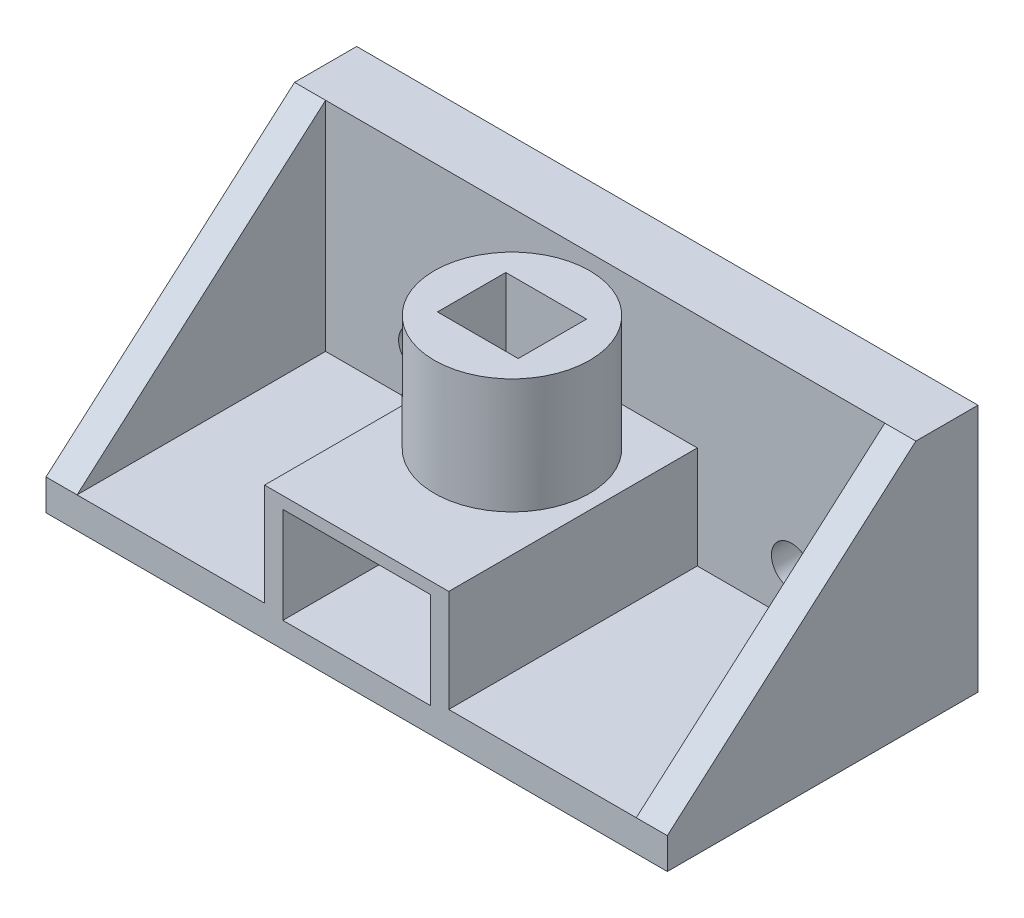
ISO-10303-21;
HEADER;
FILE_DESCRIPTION(('STEP AP214'),'2;1');
FILE_NAME('part.step','',(''),(''),'','','');
FILE_SCHEMA(('AUTOMOTIVE_DESIGN { 1 0 10303 214 1 1 1 1 }'));
ENDSEC;
DATA;
#1=APPLICATION_CONTEXT('core data for automotive mechanical design processes');
#2=APPLICATION_PROTOCOL_DEFINITION('international standard','automotive_design',2000,#1);
#3=PRODUCT_CONTEXT('',#1,'mechanical');
#4=PRODUCT('Part','Part','',(#3));
#5=PRODUCT_RELATED_PRODUCT_CATEGORY('part','',(#4));
#6=PRODUCT_DEFINITION_FORMATION('','',#4);
#7=PRODUCT_DEFINITION_CONTEXT('part definition',#1,'design');
#8=PRODUCT_DEFINITION('design','',#6,#7);
#9=PRODUCT_DEFINITION_SHAPE('','',#8);
#10=(LENGTH_UNIT() NAMED_UNIT(*) SI_UNIT(.MILLI.,.METRE.));
#11=(NAMED_UNIT(*) PLANE_ANGLE_UNIT() SI_UNIT($,.RADIAN.));
#12=(NAMED_UNIT(*) SI_UNIT($,.STERADIAN.) SOLID_ANGLE_UNIT());
#13=UNCERTAINTY_MEASURE_WITH_UNIT(LENGTH_MEASURE(1.E-05),#10,'distance_accuracy_value','');
#14=(GEOMETRIC_REPRESENTATION_CONTEXT(3) GLOBAL_UNCERTAINTY_ASSIGNED_CONTEXT((#13)) GLOBAL_UNIT_ASSIGNED_CONTEXT((#10,
#11,#12)) REPRESENTATION_CONTEXT('',''));
#15=CARTESIAN_POINT('',(0.,0.,0.));
#16=DIRECTION('',(0.,0.,1.));
#17=DIRECTION('',(1.,0.,0.));
#18=AXIS2_PLACEMENT_3D('',#15,#16,#17);
#19=CARTESIAN_POINT('',(0.,25.,0.));
#20=DIRECTION('',(0.,1.,0.));
#21=DIRECTION('',(0.,0.,1.));
#22=AXIS2_PLACEMENT_3D('',#19,#20,#21);
#23=PLANE('',#22);
#24=CARTESIAN_POINT('',(0.,25.,0.));
#25=DIRECTION('',(0.,1.,0.));
#26=DIRECTION('',(0.,0.,1.));
#27=AXIS2_PLACEMENT_3D('',#24,#25,#26);
#28=CIRCLE('',#27,7.6);
#29=CARTESIAN_POINT('',(5.24499761677732,25.,5.5));
#30=VERTEX_POINT('',#29);
#31=CARTESIAN_POINT('',(6.5,25.,3.93827373350301));
#32=VERTEX_POINT('',#31);
#33=EDGE_CURVE('E219',#30,#32,#28,.T.);
#34=ORIENTED_EDGE('',*,*,#33,.F.);
#35=DIRECTION('',(1.,0.,0.));
#36=VECTOR('',#35,1.);
#37=CARTESIAN_POINT('',(6.5,25.,5.5));
#38=LINE('',#37,#36);
#39=CARTESIAN_POINT('',(6.5,25.,5.5));
#40=VERTEX_POINT('',#39);
#41=EDGE_CURVE('E213',#30,#40,#38,.T.);
#42=ORIENTED_EDGE('',*,*,#41,.T.);
#43=DIRECTION('',(0.,0.,-1.));
#44=VECTOR('',#43,1.);
#45=CARTESIAN_POINT('',(6.5,25.,5.5));
#46=LINE('',#45,#44);
#47=EDGE_CURVE('E228',#40,#32,#46,.T.);
#48=ORIENTED_EDGE('',*,*,#47,.T.);
#49=EDGE_LOOP('',(#34,#42,#48));
#50=FACE_BOUND('',#49,.T.);
#51=ADVANCED_FACE('F40',(#50),#23,.T.);
#52=CARTESIAN_POINT('',(6.5,25.,-3.93827373350303));
#53=VERTEX_POINT('',#52);
#54=CARTESIAN_POINT('',(5.24499761677734,25.,-5.5));
#55=VERTEX_POINT('',#54);
#56=EDGE_CURVE('E819',#53,#55,#28,.T.);
#57=ORIENTED_EDGE('',*,*,#56,.F.);
#58=CARTESIAN_POINT('',(6.5,25.,-5.5));
#59=VERTEX_POINT('',#58);
#60=EDGE_CURVE('E239',#53,#59,#46,.T.);
#61=ORIENTED_EDGE('',*,*,#60,.T.);
#62=DIRECTION('',(-1.,0.,0.));
#63=VECTOR('',#62,1.);
#64=CARTESIAN_POINT('',(6.5,25.,-5.5));
#65=LINE('',#64,#63);
#66=EDGE_CURVE('E250',#59,#55,#65,.T.);
#67=ORIENTED_EDGE('',*,*,#66,.T.);
#68=EDGE_LOOP('',(#57,#61,#67));
#69=FACE_BOUND('',#68,.T.);
#70=ADVANCED_FACE('F504',(#69),#23,.T.);
#71=CARTESIAN_POINT('',(-5.24499761677737,25.,-5.5));
#72=VERTEX_POINT('',#71);
#73=CARTESIAN_POINT('',(-6.5,25.,-3.93827373350308));
#74=VERTEX_POINT('',#73);
#75=EDGE_CURVE('E816',#72,#74,#28,.T.);
#76=ORIENTED_EDGE('',*,*,#75,.F.);
#77=CARTESIAN_POINT('',(-6.5,25.,-5.5));
#78=VERTEX_POINT('',#77);
#79=EDGE_CURVE('E248',#72,#78,#65,.T.);
#80=ORIENTED_EDGE('',*,*,#79,.T.);
#81=DIRECTION('',(0.,0.,1.));
#82=VECTOR('',#81,1.);
#83=CARTESIAN_POINT('',(-6.5,25.,5.5));
#84=LINE('',#83,#82);
#85=EDGE_CURVE('E233',#78,#74,#84,.T.);
#86=ORIENTED_EDGE('',*,*,#85,.T.);
#87=EDGE_LOOP('',(#76,#80,#86));
#88=FACE_BOUND('',#87,.T.);
#89=ADVANCED_FACE('F500',(#88),#23,.T.);
#90=CARTESIAN_POINT('',(0.,5.,25.));
#91=DIRECTION('',(0.,0.,-1.));
#92=DIRECTION('',(-1.,0.,0.));
#93=AXIS2_PLACEMENT_3D('',#90,#91,#92);
#94=PLANE('',#93);
#95=DIRECTION('',(1.,0.,0.));
#96=VECTOR('',#95,1.);
#97=CARTESIAN_POINT('',(0.,5.,25.));
#98=LINE('',#97,#96);
#99=CARTESIAN_POINT('',(14.8205172242512,5.,24.9999999999999));
#100=VERTEX_POINT('',#99);
#101=CARTESIAN_POINT('',(45.,5.,25.));
#102=VERTEX_POINT('',#101);
#103=EDGE_CURVE('E324',#100,#102,#98,.T.);
#104=ORIENTED_EDGE('',*,*,#103,.F.);
#105=DIRECTION('',(0.,-1.,0.));
#106=VECTOR('',#105,1.);
#107=CARTESIAN_POINT('',(14.8205172242512,0.,24.9999999999999));
#108=LINE('',#107,#106);
#109=CARTESIAN_POINT('',(14.8205172242512,21.4552836560382,24.9999999999999));
#110=VERTEX_POINT('',#109);
#111=EDGE_CURVE('E407',#110,#100,#108,.T.);
#112=ORIENTED_EDGE('',*,*,#111,.F.);
#113=DIRECTION('',(-1.,0.,0.));
#114=VECTOR('',#113,1.);
#115=CARTESIAN_POINT('',(0.,21.4552836560382,24.9999999999999));
#116=LINE('',#115,#114);
#117=CARTESIAN_POINT('',(-14.8205172242512,21.4552836560382,24.9999999999999));
#118=VERTEX_POINT('',#117);
#119=EDGE_CURVE('E401',#110,#118,#116,.T.);
#120=ORIENTED_EDGE('',*,*,#119,.T.);
#121=DIRECTION('',(0.,-1.,0.));
#122=VECTOR('',#121,1.);
#123=CARTESIAN_POINT('',(-14.8205172242512,0.,24.9999999999999));
#124=LINE('',#123,#122);
#125=CARTESIAN_POINT('',(-14.8205172242512,5.,24.9999999999999));
#126=VERTEX_POINT('',#125);
#127=EDGE_CURVE('E399',#118,#126,#124,.T.);
#128=ORIENTED_EDGE('',*,*,#127,.T.);
#129=CARTESIAN_POINT('',(-45.,5.,25.));
#130=VERTEX_POINT('',#129);
#131=EDGE_CURVE('E329',#130,#126,#98,.T.);
#132=ORIENTED_EDGE('',*,*,#131,.F.);
#133=CARTESIAN_POINT('',(-50.,5.,25.));
#134=VERTEX_POINT('',#133);
#135=EDGE_CURVE('E326',#134,#130,#98,.T.);
#136=ORIENTED_EDGE('',*,*,#135,.F.);
#137=DIRECTION('',(0.,-1.,0.));
#138=VECTOR('',#137,1.);
#139=CARTESIAN_POINT('',(-50.,5.,25.));
#140=LINE('',#139,#138);
#141=CARTESIAN_POINT('',(-50.,0.,25.));
#142=VERTEX_POINT('',#141);
#143=EDGE_CURVE('E49',#134,#142,#140,.T.);
#144=ORIENTED_EDGE('',*,*,#143,.T.);
#145=DIRECTION('',(1.,0.,0.));
#146=VECTOR('',#145,1.);
#147=CARTESIAN_POINT('',(0.,0.,25.));
#148=LINE('',#147,#146);
#149=CARTESIAN_POINT('',(50.,0.,25.));
#150=VERTEX_POINT('',#149);
#151=EDGE_CURVE('E335',#142,#150,#148,.T.);
#152=ORIENTED_EDGE('',*,*,#151,.T.);
#153=DIRECTION('',(0.,-1.,0.));
#154=VECTOR('',#153,1.);
#155=CARTESIAN_POINT('',(50.,5.,25.));
#156=LINE('',#155,#154);
#157=CARTESIAN_POINT('',(50.,5.,25.));
#158=VERTEX_POINT('',#157);
#159=EDGE_CURVE('E328',#158,#150,#156,.T.);
#160=ORIENTED_EDGE('',*,*,#159,.F.);
#161=DIRECTION('',(1.,0.,0.));
#162=VECTOR('',#161,1.);
#163=CARTESIAN_POINT('',(45.,5.,25.));
#164=LINE('',#163,#162);
#165=EDGE_CURVE('E288',#102,#158,#164,.T.);
#166=ORIENTED_EDGE('',*,*,#165,.F.);
#167=EDGE_LOOP('',(#104,#112,#120,#128,#132,#136,#144,#152,#160,#166));
#168=FACE_BOUND('',#167,.T.);
#169=DIRECTION('',(1.,0.,0.));
#170=VECTOR('',#169,1.);
#171=CARTESIAN_POINT('',(0.,4.067012238403,25.));
#172=LINE('',#171,#170);
#173=CARTESIAN_POINT('',(-11.8828995956887,4.067012238403,25.));
#174=VERTEX_POINT('',#173);
#175=CARTESIAN_POINT('',(11.8828995956886,4.067012238403,25.));
#176=VERTEX_POINT('',#175);
#177=EDGE_CURVE('E405',#174,#176,#172,.T.);
#178=ORIENTED_EDGE('',*,*,#177,.F.);
#179=DIRECTION('',(0.,-1.,0.));
#180=VECTOR('',#179,1.);
#181=CARTESIAN_POINT('',(-11.8828995956887,0.,24.9999999999999));
#182=LINE('',#181,#180);
#183=CARTESIAN_POINT('',(-11.8828995956887,19.5424163630207,24.9999999999999));
#184=VERTEX_POINT('',#183);
#185=EDGE_CURVE('E65',#184,#174,#182,.T.);
#186=ORIENTED_EDGE('',*,*,#185,.F.);
#187=DIRECTION('',(-1.,0.,0.));
#188=VECTOR('',#187,1.);
#189=CARTESIAN_POINT('',(0.,19.5424163630207,24.9999999999999));
#190=LINE('',#189,#188);
#191=CARTESIAN_POINT('',(11.8828995956886,19.5424163630207,24.9999999999999));
#192=VERTEX_POINT('',#191);
#193=EDGE_CURVE('E415',#192,#184,#190,.T.);
#194=ORIENTED_EDGE('',*,*,#193,.F.);
#195=DIRECTION('',(0.,-1.,0.));
#196=VECTOR('',#195,1.);
#197=CARTESIAN_POINT('',(11.8828995956886,0.,24.9999999999999));
#198=LINE('',#197,#196);
#199=EDGE_CURVE('E419',#192,#176,#198,.T.);
#200=ORIENTED_EDGE('',*,*,#199,.T.);
#201=EDGE_LOOP('',(#178,#186,#194,#200));
#202=FACE_BOUND('',#201,.T.);
#203=ADVANCED_FACE('F346',(#168,#202),#94,.F.);
#204=CARTESIAN_POINT('',(-50.,40.,-25.));
#205=DIRECTION('',(0.,0.,-1.));
#206=DIRECTION('',(-1.,0.,0.));
#207=AXIS2_PLACEMENT_3D('',#204,#205,#206);
#208=PLANE('',#207);
#209=DIRECTION('',(1.,0.,0.));
#210=VECTOR('',#209,1.);
#211=CARTESIAN_POINT('',(-50.,0.,-25.));
#212=LINE('',#211,#210);
#213=CARTESIAN_POINT('',(-50.,0.,-25.));
#214=VERTEX_POINT('',#213);
#215=CARTESIAN_POINT('',(50.,0.,-25.));
#216=VERTEX_POINT('',#215);
#217=EDGE_CURVE('E294',#214,#216,#212,.T.);
#218=ORIENTED_EDGE('',*,*,#217,.F.);
#219=DIRECTION('',(0.,-1.,0.));
#220=VECTOR('',#219,1.);
#221=CARTESIAN_POINT('',(-50.,40.,-25.));
#222=LINE('',#221,#220);
#223=CARTESIAN_POINT('',(-50.,40.,-25.));
#224=VERTEX_POINT('',#223);
#225=EDGE_CURVE('E309',#224,#214,#222,.T.);
#226=ORIENTED_EDGE('',*,*,#225,.F.);
#227=DIRECTION('',(1.,0.,0.));
#228=VECTOR('',#227,1.);
#229=CARTESIAN_POINT('',(-50.,40.,-25.));
#230=LINE('',#229,#228);
#231=CARTESIAN_POINT('',(50.,40.,-25.));
#232=VERTEX_POINT('',#231);
#233=EDGE_CURVE('E303',#224,#232,#230,.T.);
#234=ORIENTED_EDGE('',*,*,#233,.T.);
#235=DIRECTION('',(0.,-1.,0.));
#236=VECTOR('',#235,1.);
#237=CARTESIAN_POINT('',(50.,40.,-25.));
#238=LINE('',#237,#236);
#239=EDGE_CURVE('E314',#232,#216,#238,.T.);
#240=ORIENTED_EDGE('',*,*,#239,.T.);
#241=EDGE_LOOP('',(#218,#226,#234,#240));
#242=FACE_BOUND('',#241,.T.);
#243=CARTESIAN_POINT('',(-30.,12.5,-25.));
#244=DIRECTION('',(0.,0.,-1.));
#245=DIRECTION('',(-1.,0.,0.));
#246=AXIS2_PLACEMENT_3D('',#243,#244,#245);
#247=CIRCLE('',#246,3.25);
#248=CARTESIAN_POINT('',(-33.25,12.5,-25.));
#249=VERTEX_POINT('',#248);
#250=EDGE_CURVE('E443',#249,#249,#247,.T.);
#251=ORIENTED_EDGE('',*,*,#250,.F.);
#252=EDGE_LOOP('',(#251));
#253=FACE_BOUND('',#252,.T.);
#254=CARTESIAN_POINT('',(30.,12.5,-25.));
#255=DIRECTION('',(0.,0.,1.));
#256=DIRECTION('',(1.,0.,0.));
#257=AXIS2_PLACEMENT_3D('',#254,#255,#256);
#258=CIRCLE('',#257,3.25);
#259=CARTESIAN_POINT('',(33.25,12.5,-25.));
#260=VERTEX_POINT('',#259);
#261=EDGE_CURVE('E437',#260,#260,#258,.T.);
#262=ORIENTED_EDGE('',*,*,#261,.T.);
#263=EDGE_LOOP('',(#262));
#264=FACE_BOUND('',#263,.T.);
#265=DIRECTION('',(-1.,0.,0.));
#266=VECTOR('',#265,1.);
#267=CARTESIAN_POINT('',(-50.,19.5424163630207,-25.));
#268=LINE('',#267,#266);
#269=CARTESIAN_POINT('',(11.8828995956886,19.5424163630207,-25.));
#270=VERTEX_POINT('',#269);
#271=CARTESIAN_POINT('',(-11.8828995956887,19.5424163630207,-25.));
#272=VERTEX_POINT('',#271);
#273=EDGE_CURVE('E570',#270,#272,#268,.T.);
#274=ORIENTED_EDGE('',*,*,#273,.T.);
#275=DIRECTION('',(0.,-1.,0.));
#276=VECTOR('',#275,1.);
#277=CARTESIAN_POINT('',(-11.8828995956886,40.,-25.));
#278=LINE('',#277,#276);
#279=CARTESIAN_POINT('',(-11.8828995956887,4.067012238403,-25.));
#280=VERTEX_POINT('',#279);
#281=EDGE_CURVE('E567',#272,#280,#278,.T.);
#282=ORIENTED_EDGE('',*,*,#281,.T.);
#283=DIRECTION('',(1.,0.,0.));
#284=VECTOR('',#283,1.);
#285=CARTESIAN_POINT('',(-50.,4.067012238403,-25.));
#286=LINE('',#285,#284);
#287=CARTESIAN_POINT('',(11.8828995956886,4.067012238403,-25.));
#288=VERTEX_POINT('',#287);
#289=EDGE_CURVE('E410',#280,#288,#286,.T.);
#290=ORIENTED_EDGE('',*,*,#289,.T.);
#291=DIRECTION('',(0.,1.,0.));
#292=VECTOR('',#291,1.);
#293=CARTESIAN_POINT('',(11.8828995956886,40.,-25.));
#294=LINE('',#293,#292);
#295=EDGE_CURVE('E564',#288,#270,#294,.T.);
#296=ORIENTED_EDGE('',*,*,#295,.T.);
#297=EDGE_LOOP('',(#274,#282,#290,#296));
#298=FACE_BOUND('',#297,.T.);
#299=ADVANCED_FACE('F359',(#242,#253,#264,#298),#208,.T.);
#300=CARTESIAN_POINT('',(0.,5.,0.));
#301=DIRECTION('',(0.,1.,0.));
#302=DIRECTION('',(0.,0.,1.));
#303=AXIS2_PLACEMENT_3D('',#300,#301,#302);
#304=PLANE('',#303);
#305=ORIENTED_EDGE('',*,*,#131,.T.);
#306=DIRECTION('',(0.,0.,-1.));
#307=VECTOR('',#306,1.);
#308=CARTESIAN_POINT('',(-14.8205172242512,5.,0.));
#309=LINE('',#308,#307);
#310=CARTESIAN_POINT('',(-14.8205172242512,5.,-15.));
#311=VERTEX_POINT('',#310);
#312=EDGE_CURVE('E396',#126,#311,#309,.T.);
#313=ORIENTED_EDGE('',*,*,#312,.T.);
#314=DIRECTION('',(1.,0.,0.));
#315=VECTOR('',#314,1.);
#316=CARTESIAN_POINT('',(0.,5.,-15.));
#317=LINE('',#316,#315);
#318=CARTESIAN_POINT('',(-45.,5.,-15.));
#319=VERTEX_POINT('',#318);
#320=EDGE_CURVE('E321',#319,#311,#317,.T.);
#321=ORIENTED_EDGE('',*,*,#320,.F.);
#322=DIRECTION('',(0.,0.,1.));
#323=VECTOR('',#322,1.);
#324=CARTESIAN_POINT('',(-45.,5.,-15.));
#325=LINE('',#324,#323);
#326=EDGE_CURVE('E272',#319,#130,#325,.T.);
#327=ORIENTED_EDGE('',*,*,#326,.T.);
#328=EDGE_LOOP('',(#305,#313,#321,#327));
#329=FACE_BOUND('',#328,.T.);
#330=ADVANCED_FACE('F394',(#329),#304,.T.);
#331=CARTESIAN_POINT('',(-50.,40.,-15.));
#332=DIRECTION('',(0.,0.,-1.));
#333=DIRECTION('',(-1.,0.,0.));
#334=AXIS2_PLACEMENT_3D('',#331,#332,#333);
#335=PLANE('',#334);
#336=CARTESIAN_POINT('',(-30.,12.5,-15.));
#337=DIRECTION('',(0.,0.,-1.));
#338=DIRECTION('',(-1.,0.,0.));
#339=AXIS2_PLACEMENT_3D('',#336,#337,#338);
#340=CIRCLE('',#339,3.25);
#341=CARTESIAN_POINT('',(-33.25,12.5,-15.));
#342=VERTEX_POINT('',#341);
#343=EDGE_CURVE('E446',#342,#342,#340,.T.);
#344=ORIENTED_EDGE('',*,*,#343,.T.);
#345=EDGE_LOOP('',(#344));
#346=FACE_BOUND('',#345,.T.);
#347=CARTESIAN_POINT('',(30.,12.5,-15.));
#348=DIRECTION('',(0.,0.,-1.));
#349=DIRECTION('',(-1.,0.,0.));
#350=AXIS2_PLACEMENT_3D('',#347,#348,#349);
#351=CIRCLE('',#350,3.25);
#352=CARTESIAN_POINT('',(26.75,12.5,-15.));
#353=VERTEX_POINT('',#352);
#354=EDGE_CURVE('E440',#353,#353,#351,.F.);
#355=ORIENTED_EDGE('',*,*,#354,.F.);
#356=EDGE_LOOP('',(#355));
#357=FACE_BOUND('',#356,.T.);
#358=DIRECTION('',(0.,-1.,0.));
#359=VECTOR('',#358,1.);
#360=CARTESIAN_POINT('',(-14.8205172242512,40.,-15.));
#361=LINE('',#360,#359);
#362=CARTESIAN_POINT('',(-14.8205172242512,21.4552836560382,-15.));
#363=VERTEX_POINT('',#362);
#364=EDGE_CURVE('E434',#363,#311,#361,.T.);
#365=ORIENTED_EDGE('',*,*,#364,.F.);
#366=DIRECTION('',(-1.,0.,0.));
#367=VECTOR('',#366,1.);
#368=CARTESIAN_POINT('',(-50.,21.4552836560382,-15.));
#369=LINE('',#368,#367);
#370=CARTESIAN_POINT('',(14.8205172242512,21.4552836560382,-15.));
#371=VERTEX_POINT('',#370);
#372=EDGE_CURVE('E424',#371,#363,#369,.T.);
#373=ORIENTED_EDGE('',*,*,#372,.F.);
#374=DIRECTION('',(0.,-1.,0.));
#375=VECTOR('',#374,1.);
#376=CARTESIAN_POINT('',(14.8205172242512,40.,-15.));
#377=LINE('',#376,#375);
#378=CARTESIAN_POINT('',(14.8205172242512,5.,-15.));
#379=VERTEX_POINT('',#378);
#380=EDGE_CURVE('E385',#371,#379,#377,.T.);
#381=ORIENTED_EDGE('',*,*,#380,.T.);
#382=CARTESIAN_POINT('',(45.,5.,-15.));
#383=VERTEX_POINT('',#382);
#384=EDGE_CURVE('E325',#379,#383,#317,.T.);
#385=ORIENTED_EDGE('',*,*,#384,.T.);
#386=DIRECTION('',(0.,1.,0.));
#387=VECTOR('',#386,1.);
#388=CARTESIAN_POINT('',(45.,40.,-15.));
#389=LINE('',#388,#387);
#390=CARTESIAN_POINT('',(45.,40.,-15.));
#391=VERTEX_POINT('',#390);
#392=EDGE_CURVE('E285',#383,#391,#389,.T.);
#393=ORIENTED_EDGE('',*,*,#392,.T.);
#394=DIRECTION('',(1.,0.,0.));
#395=VECTOR('',#394,1.);
#396=CARTESIAN_POINT('',(-50.,40.,-15.));
#397=LINE('',#396,#395);
#398=CARTESIAN_POINT('',(-45.,40.,-15.));
#399=VERTEX_POINT('',#398);
#400=EDGE_CURVE('E300',#399,#391,#397,.T.);
#401=ORIENTED_EDGE('',*,*,#400,.F.);
#402=DIRECTION('',(0.,-1.,0.));
#403=VECTOR('',#402,1.);
#404=CARTESIAN_POINT('',(-45.,40.,-15.));
#405=LINE('',#404,#403);
#406=EDGE_CURVE('E268',#399,#319,#405,.T.);
#407=ORIENTED_EDGE('',*,*,#406,.T.);
#408=ORIENTED_EDGE('',*,*,#320,.T.);
#409=EDGE_LOOP('',(#365,#373,#381,#385,#393,#401,#407,#408));
#410=FACE_BOUND('',#409,.T.);
#411=ADVANCED_FACE('F381',(#346,#357,#410),#335,.F.);
#412=DIRECTION('',(0.,0.,-1.));
#413=VECTOR('',#412,1.);
#414=CARTESIAN_POINT('',(14.8205172242512,5.,0.));
#415=LINE('',#414,#413);
#416=EDGE_CURVE('E389',#100,#379,#415,.T.);
#417=ORIENTED_EDGE('',*,*,#416,.F.);
#418=ORIENTED_EDGE('',*,*,#103,.T.);
#419=DIRECTION('',(0.,0.,-1.));
#420=VECTOR('',#419,1.);
#421=CARTESIAN_POINT('',(45.,5.,-15.));
#422=LINE('',#421,#420);
#423=EDGE_CURVE('E282',#102,#383,#422,.T.);
#424=ORIENTED_EDGE('',*,*,#423,.T.);
#425=ORIENTED_EDGE('',*,*,#384,.F.);
#426=EDGE_LOOP('',(#417,#418,#424,#425));
#427=FACE_BOUND('',#426,.T.);
#428=ADVANCED_FACE('F388',(#427),#304,.T.);
#429=CARTESIAN_POINT('',(-50.,5.,0.));
#430=DIRECTION('',(1.,0.,0.));
#431=DIRECTION('',(0.,0.,-1.));
#432=AXIS2_PLACEMENT_3D('',#429,#430,#431);
#433=PLANE('',#432);
#434=ORIENTED_EDGE('',*,*,#143,.F.);
#435=DIRECTION('',(0.,0.658504607868518,-0.752576694706878));
#436=VECTOR('',#435,1.);
#437=CARTESIAN_POINT('',(-50.,5.,25.));
#438=LINE('',#437,#436);
#439=CARTESIAN_POINT('',(-50.,40.,-15.));
#440=VERTEX_POINT('',#439);
#441=EDGE_CURVE('E269',#134,#440,#438,.T.);
#442=ORIENTED_EDGE('',*,*,#441,.T.);
#443=DIRECTION('',(0.,0.,-1.));
#444=VECTOR('',#443,1.);
#445=CARTESIAN_POINT('',(-50.,40.,-15.));
#446=LINE('',#445,#444);
#447=EDGE_CURVE('E306',#440,#224,#446,.T.);
#448=ORIENTED_EDGE('',*,*,#447,.T.);
#449=ORIENTED_EDGE('',*,*,#225,.T.);
#450=DIRECTION('',(0.,0.,1.));
#451=VECTOR('',#450,1.);
#452=CARTESIAN_POINT('',(-50.,0.,0.));
#453=LINE('',#452,#451);
#454=EDGE_CURVE('E332',#214,#142,#453,.T.);
#455=ORIENTED_EDGE('',*,*,#454,.T.);
#456=EDGE_LOOP('',(#434,#442,#448,#449,#455));
#457=FACE_BOUND('',#456,.T.);
#458=ADVANCED_FACE('F351',(#457),#433,.F.);
#459=CARTESIAN_POINT('',(0.,5.,0.));
#460=DIRECTION('',(0.,-1.,0.));
#461=DIRECTION('',(0.,0.,-1.));
#462=AXIS2_PLACEMENT_3D('',#459,#460,#461);
#463=CYLINDRICAL_SURFACE('',#462,7.6);
#464=CARTESIAN_POINT('',(0.,0.,0.));
#465=DIRECTION('',(0.,1.,0.));
#466=DIRECTION('',(0.,0.,1.));
#467=AXIS2_PLACEMENT_3D('',#464,#465,#466);
#468=CIRCLE('',#467,7.6);
#469=CARTESIAN_POINT('',(0.,0.,7.59999999999999));
#470=VERTEX_POINT('',#469);
#471=EDGE_CURVE('E320',#470,#470,#468,.T.);
#472=ORIENTED_EDGE('',*,*,#471,.F.);
#473=EDGE_LOOP('',(#472));
#474=FACE_BOUND('',#473,.T.);
#475=CARTESIAN_POINT('',(0.,4.067012238403,0.));
#476=DIRECTION('',(0.,-1.,0.));
#477=DIRECTION('',(0.,0.,-1.));
#478=AXIS2_PLACEMENT_3D('',#475,#476,#477);
#479=CIRCLE('',#478,7.6);
#480=CARTESIAN_POINT('',(0.,4.067012238403,-7.60000000000001));
#481=VERTEX_POINT('',#480);
#482=EDGE_CURVE('E554',#481,#481,#479,.F.);
#483=ORIENTED_EDGE('',*,*,#482,.T.);
#484=EDGE_LOOP('',(#483));
#485=FACE_BOUND('',#484,.T.);
#486=ADVANCED_FACE('F42',(#474,#485),#463,.F.);
#487=CARTESIAN_POINT('',(50.,5.,0.));
#488=DIRECTION('',(1.,0.,0.));
#489=DIRECTION('',(0.,0.,-1.));
#490=AXIS2_PLACEMENT_3D('',#487,#488,#489);
#491=PLANE('',#490);
#492=DIRECTION('',(0.,-0.658504607868518,0.752576694706878));
#493=VECTOR('',#492,1.);
#494=CARTESIAN_POINT('',(50.,5.,25.));
#495=LINE('',#494,#493);
#496=CARTESIAN_POINT('',(50.,40.,-15.));
#497=VERTEX_POINT('',#496);
#498=EDGE_CURVE('E275',#497,#158,#495,.T.);
#499=ORIENTED_EDGE('',*,*,#498,.T.);
#500=ORIENTED_EDGE('',*,*,#159,.T.);
#501=DIRECTION('',(0.,0.,1.));
#502=VECTOR('',#501,1.);
#503=CARTESIAN_POINT('',(50.,0.,0.));
#504=LINE('',#503,#502);
#505=EDGE_CURVE('E338',#216,#150,#504,.T.);
#506=ORIENTED_EDGE('',*,*,#505,.F.);
#507=ORIENTED_EDGE('',*,*,#239,.F.);
#508=DIRECTION('',(0.,0.,1.));
#509=VECTOR('',#508,1.);
#510=CARTESIAN_POINT('',(50.,40.,-25.));
#511=LINE('',#510,#509);
#512=EDGE_CURVE('E299',#232,#497,#511,.T.);
#513=ORIENTED_EDGE('',*,*,#512,.T.);
#514=EDGE_LOOP('',(#499,#500,#506,#507,#513));
#515=FACE_BOUND('',#514,.T.);
#516=ADVANCED_FACE('F356',(#515),#491,.T.);
#517=CARTESIAN_POINT('',(0.,0.,0.));
#518=DIRECTION('',(0.,1.,0.));
#519=DIRECTION('',(0.,0.,1.));
#520=AXIS2_PLACEMENT_3D('',#517,#518,#519);
#521=PLANE('',#520);
#522=ORIENTED_EDGE('',*,*,#471,.T.);
#523=EDGE_LOOP('',(#522));
#524=FACE_BOUND('',#523,.T.);
#525=ORIENTED_EDGE('',*,*,#454,.F.);
#526=ORIENTED_EDGE('',*,*,#217,.T.);
#527=ORIENTED_EDGE('',*,*,#505,.T.);
#528=ORIENTED_EDGE('',*,*,#151,.F.);
#529=EDGE_LOOP('',(#525,#526,#527,#528));
#530=FACE_BOUND('',#529,.T.);
#531=ADVANCED_FACE('F354',(#524,#530),#521,.F.);
#532=CARTESIAN_POINT('',(0.,40.,0.));
#533=DIRECTION('',(0.,-1.,0.));
#534=DIRECTION('',(-1.,0.,0.));
#535=AXIS2_PLACEMENT_3D('',#532,#533,#534);
#536=PLANE('',#535);
#537=EDGE_CURVE('E296',#440,#399,#397,.T.);
#538=ORIENTED_EDGE('',*,*,#537,.T.);
#539=ORIENTED_EDGE('',*,*,#400,.T.);
#540=DIRECTION('',(1.,0.,0.));
#541=VECTOR('',#540,1.);
#542=CARTESIAN_POINT('',(45.,40.,-15.));
#543=LINE('',#542,#541);
#544=EDGE_CURVE('E291',#391,#497,#543,.T.);
#545=ORIENTED_EDGE('',*,*,#544,.T.);
#546=ORIENTED_EDGE('',*,*,#512,.F.);
#547=ORIENTED_EDGE('',*,*,#233,.F.);
#548=ORIENTED_EDGE('',*,*,#447,.F.);
#549=EDGE_LOOP('',(#538,#539,#545,#546,#547,#548));
#550=FACE_BOUND('',#549,.T.);
#551=ADVANCED_FACE('F364',(#550),#536,.F.);
#552=CARTESIAN_POINT('',(45.,5.,25.));
#553=DIRECTION('',(0.,0.752576694706878,0.658504607868518));
#554=DIRECTION('',(0.,-0.658504607868518,0.752576694706878));
#555=AXIS2_PLACEMENT_3D('',#552,#553,#554);
#556=PLANE('',#555);
#557=ORIENTED_EDGE('',*,*,#498,.F.);
#558=ORIENTED_EDGE('',*,*,#544,.F.);
#559=DIRECTION('',(0.,-0.658504607868518,0.752576694706878));
#560=VECTOR('',#559,1.);
#561=CARTESIAN_POINT('',(45.,5.,25.));
#562=LINE('',#561,#560);
#563=EDGE_CURVE('E279',#391,#102,#562,.T.);
#564=ORIENTED_EDGE('',*,*,#563,.T.);
#565=ORIENTED_EDGE('',*,*,#165,.T.);
#566=EDGE_LOOP('',(#557,#558,#564,#565));
#567=FACE_BOUND('',#566,.T.);
#568=ADVANCED_FACE('F374',(#567),#556,.T.);
#569=CARTESIAN_POINT('',(45.,0.,0.));
#570=DIRECTION('',(-1.,0.,0.));
#571=DIRECTION('',(0.,0.,1.));
#572=AXIS2_PLACEMENT_3D('',#569,#570,#571);
#573=PLANE('',#572);
#574=ORIENTED_EDGE('',*,*,#563,.F.);
#575=ORIENTED_EDGE('',*,*,#392,.F.);
#576=ORIENTED_EDGE('',*,*,#423,.F.);
#577=EDGE_LOOP('',(#574,#575,#576));
#578=FACE_BOUND('',#577,.T.);
#579=ADVANCED_FACE('F379',(#578),#573,.T.);
#580=CARTESIAN_POINT('',(-45.,5.,25.));
#581=DIRECTION('',(0.,0.752576694706878,0.658504607868518));
#582=DIRECTION('',(0.,-0.658504607868518,0.752576694706878));
#583=AXIS2_PLACEMENT_3D('',#580,#581,#582);
#584=PLANE('',#583);
#585=ORIENTED_EDGE('',*,*,#441,.F.);
#586=ORIENTED_EDGE('',*,*,#135,.T.);
#587=DIRECTION('',(0.,0.658504607868518,-0.752576694706878));
#588=VECTOR('',#587,1.);
#589=CARTESIAN_POINT('',(-45.,5.,25.));
#590=LINE('',#589,#588);
#591=EDGE_CURVE('E266',#130,#399,#590,.T.);
#592=ORIENTED_EDGE('',*,*,#591,.T.);
#593=ORIENTED_EDGE('',*,*,#537,.F.);
#594=EDGE_LOOP('',(#585,#586,#592,#593));
#595=FACE_BOUND('',#594,.T.);
#596=ADVANCED_FACE('F366',(#595),#584,.T.);
#597=CARTESIAN_POINT('',(-45.,0.,0.));
#598=DIRECTION('',(-1.,0.,0.));
#599=DIRECTION('',(0.,0.,1.));
#600=AXIS2_PLACEMENT_3D('',#597,#598,#599);
#601=PLANE('',#600);
#602=ORIENTED_EDGE('',*,*,#591,.F.);
#603=ORIENTED_EDGE('',*,*,#326,.F.);
#604=ORIENTED_EDGE('',*,*,#406,.F.);
#605=EDGE_LOOP('',(#602,#603,#604));
#606=FACE_BOUND('',#605,.T.);
#607=ADVANCED_FACE('F519',(#606),#601,.F.);
#608=CARTESIAN_POINT('',(-30.,12.5,180.));
#609=DIRECTION('',(0.,0.,-1.));
#610=DIRECTION('',(-1.,0.,0.));
#611=AXIS2_PLACEMENT_3D('',#608,#609,#610);
#612=CYLINDRICAL_SURFACE('',#611,3.25);
#613=ORIENTED_EDGE('',*,*,#250,.T.);
#614=EDGE_LOOP('',(#613));
#615=FACE_BOUND('',#614,.T.);
#616=ORIENTED_EDGE('',*,*,#343,.F.);
#617=EDGE_LOOP('',(#616));
#618=FACE_BOUND('',#617,.T.);
#619=ADVANCED_FACE('F510',(#615,#618),#612,.F.);
#620=CARTESIAN_POINT('',(30.,12.5,180.));
#621=DIRECTION('',(0.,0.,-1.));
#622=DIRECTION('',(-1.,0.,0.));
#623=AXIS2_PLACEMENT_3D('',#620,#621,#622);
#624=CYLINDRICAL_SURFACE('',#623,3.25);
#625=ORIENTED_EDGE('',*,*,#261,.F.);
#626=EDGE_LOOP('',(#625));
#627=FACE_BOUND('',#626,.T.);
#628=ORIENTED_EDGE('',*,*,#354,.T.);
#629=EDGE_LOOP('',(#628));
#630=FACE_BOUND('',#629,.T.);
#631=ADVANCED_FACE('F488',(#627,#630),#624,.F.);
#632=CARTESIAN_POINT('',(0.,21.4552836560382,24.9999999999999));
#633=DIRECTION('',(0.,-1.,0.));
#634=DIRECTION('',(0.,0.,-1.));
#635=AXIS2_PLACEMENT_3D('',#632,#633,#634);
#636=PLANE('',#635);
#637=CARTESIAN_POINT('',(0.,21.4552836560382,0.));
#638=DIRECTION('',(0.,-1.,0.));
#639=DIRECTION('',(0.,0.,-1.));
#640=AXIS2_PLACEMENT_3D('',#637,#638,#639);
#641=CIRCLE('',#640,12.5);
#642=CARTESIAN_POINT('',(0.,21.4552836560382,-12.5));
#643=VERTEX_POINT('',#642);
#644=EDGE_CURVE('E11',#643,#643,#641,.T.);
#645=ORIENTED_EDGE('',*,*,#644,.T.);
#646=EDGE_LOOP('',(#645));
#647=FACE_BOUND('',#646,.T.);
#648=DIRECTION('',(0.,0.,-1.));
#649=VECTOR('',#648,1.);
#650=CARTESIAN_POINT('',(14.8205172242512,21.4552836560382,24.9999999999999));
#651=LINE('',#650,#649);
#652=EDGE_CURVE('E427',#110,#371,#651,.T.);
#653=ORIENTED_EDGE('',*,*,#652,.T.);
#654=ORIENTED_EDGE('',*,*,#372,.T.);
#655=DIRECTION('',(0.,0.,-1.));
#656=VECTOR('',#655,1.);
#657=CARTESIAN_POINT('',(-14.8205172242512,21.4552836560382,24.9999999999999));
#658=LINE('',#657,#656);
#659=EDGE_CURVE('E421',#118,#363,#658,.T.);
#660=ORIENTED_EDGE('',*,*,#659,.F.);
#661=ORIENTED_EDGE('',*,*,#119,.F.);
#662=EDGE_LOOP('',(#653,#654,#660,#661));
#663=FACE_BOUND('',#662,.T.);
#664=ADVANCED_FACE('F484',(#647,#663),#636,.F.);
#665=CARTESIAN_POINT('',(14.8205172242512,0.,24.9999999999999));
#666=DIRECTION('',(1.,0.,0.));
#667=DIRECTION('',(0.,0.,-1.));
#668=AXIS2_PLACEMENT_3D('',#665,#666,#667);
#669=PLANE('',#668);
#670=ORIENTED_EDGE('',*,*,#111,.T.);
#671=ORIENTED_EDGE('',*,*,#416,.T.);
#672=ORIENTED_EDGE('',*,*,#380,.F.);
#673=ORIENTED_EDGE('',*,*,#652,.F.);
#674=EDGE_LOOP('',(#670,#671,#672,#673));
#675=FACE_BOUND('',#674,.T.);
#676=ADVANCED_FACE('F487',(#675),#669,.T.);
#677=CARTESIAN_POINT('',(-14.8205172242512,0.,24.9999999999999));
#678=DIRECTION('',(1.,0.,0.));
#679=DIRECTION('',(0.,0.,-1.));
#680=AXIS2_PLACEMENT_3D('',#677,#678,#679);
#681=PLANE('',#680);
#682=ORIENTED_EDGE('',*,*,#312,.F.);
#683=ORIENTED_EDGE('',*,*,#127,.F.);
#684=ORIENTED_EDGE('',*,*,#659,.T.);
#685=ORIENTED_EDGE('',*,*,#364,.T.);
#686=EDGE_LOOP('',(#682,#683,#684,#685));
#687=FACE_BOUND('',#686,.T.);
#688=ADVANCED_FACE('F491',(#687),#681,.F.);
#689=CARTESIAN_POINT('',(-6.5,25.,3.93827373350306));
#690=VERTEX_POINT('',#689);
#691=CARTESIAN_POINT('',(-5.24499761677735,25.,5.5));
#692=VERTEX_POINT('',#691);
#693=EDGE_CURVE('E222',#690,#692,#28,.T.);
#694=ORIENTED_EDGE('',*,*,#693,.F.);
#695=CARTESIAN_POINT('',(-6.5,25.,5.5));
#696=VERTEX_POINT('',#695);
#697=EDGE_CURVE('E237',#690,#696,#84,.T.);
#698=ORIENTED_EDGE('',*,*,#697,.T.);
#699=EDGE_CURVE('E212',#696,#692,#38,.T.);
#700=ORIENTED_EDGE('',*,*,#699,.T.);
#701=EDGE_LOOP('',(#694,#698,#700));
#702=FACE_BOUND('',#701,.T.);
#703=ADVANCED_FACE('F493',(#702),#23,.T.);
#704=CARTESIAN_POINT('',(6.5,25.,5.5));
#705=DIRECTION('',(0.,0.,1.));
#706=DIRECTION('',(1.,0.,0.));
#707=AXIS2_PLACEMENT_3D('',#704,#705,#706);
#708=PLANE('',#707);
#709=DIRECTION('',(1.,0.,0.));
#710=VECTOR('',#709,1.);
#711=CARTESIAN_POINT('',(6.5,40.,5.5));
#712=LINE('',#711,#710);
#713=CARTESIAN_POINT('',(-6.5,40.,5.5));
#714=VERTEX_POINT('',#713);
#715=CARTESIAN_POINT('',(6.5,40.,5.5));
#716=VERTEX_POINT('',#715);
#717=EDGE_CURVE('E451',#714,#716,#712,.T.);
#718=ORIENTED_EDGE('',*,*,#717,.T.);
#719=DIRECTION('',(0.,1.,0.));
#720=VECTOR('',#719,1.);
#721=CARTESIAN_POINT('',(6.5,25.,5.5));
#722=LINE('',#721,#720);
#723=EDGE_CURVE('E232',#40,#716,#722,.T.);
#724=ORIENTED_EDGE('',*,*,#723,.F.);
#725=ORIENTED_EDGE('',*,*,#41,.F.);
#726=EDGE_CURVE('E204',#692,#30,#38,.T.);
#727=ORIENTED_EDGE('',*,*,#726,.F.);
#728=ORIENTED_EDGE('',*,*,#699,.F.);
#729=DIRECTION('',(0.,1.,0.));
#730=VECTOR('',#729,1.);
#731=CARTESIAN_POINT('',(-6.5,25.,5.5));
#732=LINE('',#731,#730);
#733=EDGE_CURVE('E256',#696,#714,#732,.T.);
#734=ORIENTED_EDGE('',*,*,#733,.T.);
#735=EDGE_LOOP('',(#718,#724,#725,#727,#728,#734));
#736=FACE_BOUND('',#735,.T.);
#737=ADVANCED_FACE('F231',(#736),#708,.F.);
#738=CARTESIAN_POINT('',(6.5,25.,5.5));
#739=DIRECTION('',(1.,0.,0.));
#740=DIRECTION('',(0.,0.,-1.));
#741=AXIS2_PLACEMENT_3D('',#738,#739,#740);
#742=PLANE('',#741);
#743=DIRECTION('',(0.,0.,-1.));
#744=VECTOR('',#743,1.);
#745=CARTESIAN_POINT('',(6.5,40.,5.5));
#746=LINE('',#745,#744);
#747=CARTESIAN_POINT('',(6.5,40.,-5.5));
#748=VERTEX_POINT('',#747);
#749=EDGE_CURVE('E454',#716,#748,#746,.T.);
#750=ORIENTED_EDGE('',*,*,#749,.T.);
#751=DIRECTION('',(0.,1.,0.));
#752=VECTOR('',#751,1.);
#753=CARTESIAN_POINT('',(6.5,25.,-5.5));
#754=LINE('',#753,#752);
#755=EDGE_CURVE('E262',#59,#748,#754,.T.);
#756=ORIENTED_EDGE('',*,*,#755,.F.);
#757=ORIENTED_EDGE('',*,*,#60,.F.);
#758=EDGE_CURVE('E241',#32,#53,#46,.T.);
#759=ORIENTED_EDGE('',*,*,#758,.F.);
#760=ORIENTED_EDGE('',*,*,#47,.F.);
#761=ORIENTED_EDGE('',*,*,#723,.T.);
#762=EDGE_LOOP('',(#750,#756,#757,#759,#760,#761));
#763=FACE_BOUND('',#762,.T.);
#764=ADVANCED_FACE('F468',(#763),#742,.F.);
#765=CARTESIAN_POINT('',(6.5,25.,-5.5));
#766=DIRECTION('',(0.,0.,-1.));
#767=DIRECTION('',(-1.,0.,0.));
#768=AXIS2_PLACEMENT_3D('',#765,#766,#767);
#769=PLANE('',#768);
#770=DIRECTION('',(-1.,0.,0.));
#771=VECTOR('',#770,1.);
#772=CARTESIAN_POINT('',(6.5,40.,-5.5));
#773=LINE('',#772,#771);
#774=CARTESIAN_POINT('',(-6.5,40.,-5.5));
#775=VERTEX_POINT('',#774);
#776=EDGE_CURVE('E459',#748,#775,#773,.T.);
#777=ORIENTED_EDGE('',*,*,#776,.T.);
#778=DIRECTION('',(0.,1.,0.));
#779=VECTOR('',#778,1.);
#780=CARTESIAN_POINT('',(-6.5,25.,-5.5));
#781=LINE('',#780,#779);
#782=EDGE_CURVE('E278',#78,#775,#781,.T.);
#783=ORIENTED_EDGE('',*,*,#782,.F.);
#784=ORIENTED_EDGE('',*,*,#79,.F.);
#785=EDGE_CURVE('E249',#55,#72,#65,.T.);
#786=ORIENTED_EDGE('',*,*,#785,.F.);
#787=ORIENTED_EDGE('',*,*,#66,.F.);
#788=ORIENTED_EDGE('',*,*,#755,.T.);
#789=EDGE_LOOP('',(#777,#783,#784,#786,#787,#788));
#790=FACE_BOUND('',#789,.T.);
#791=ADVANCED_FACE('F463',(#790),#769,.F.);
#792=CARTESIAN_POINT('',(-6.5,25.,5.5));
#793=DIRECTION('',(-1.,0.,0.));
#794=DIRECTION('',(0.,0.,1.));
#795=AXIS2_PLACEMENT_3D('',#792,#793,#794);
#796=PLANE('',#795);
#797=DIRECTION('',(0.,0.,1.));
#798=VECTOR('',#797,1.);
#799=CARTESIAN_POINT('',(-6.5,40.,5.5));
#800=LINE('',#799,#798);
#801=EDGE_CURVE('E448',#775,#714,#800,.T.);
#802=ORIENTED_EDGE('',*,*,#801,.T.);
#803=ORIENTED_EDGE('',*,*,#733,.F.);
#804=ORIENTED_EDGE('',*,*,#697,.F.);
#805=EDGE_CURVE('E235',#74,#690,#84,.T.);
#806=ORIENTED_EDGE('',*,*,#805,.F.);
#807=ORIENTED_EDGE('',*,*,#85,.F.);
#808=ORIENTED_EDGE('',*,*,#782,.T.);
#809=EDGE_LOOP('',(#802,#803,#804,#806,#807,#808));
#810=FACE_BOUND('',#809,.T.);
#811=ADVANCED_FACE('F474',(#810),#796,.F.);
#812=CARTESIAN_POINT('',(0.,40.,0.));
#813=DIRECTION('',(0.,1.,0.));
#814=DIRECTION('',(0.,0.,1.));
#815=AXIS2_PLACEMENT_3D('',#812,#813,#814);
#816=PLANE('',#815);
#817=ORIENTED_EDGE('',*,*,#801,.F.);
#818=ORIENTED_EDGE('',*,*,#776,.F.);
#819=ORIENTED_EDGE('',*,*,#749,.F.);
#820=ORIENTED_EDGE('',*,*,#717,.F.);
#821=EDGE_LOOP('',(#817,#818,#819,#820));
#822=FACE_BOUND('',#821,.T.);
#823=CARTESIAN_POINT('',(0.,40.,0.));
#824=DIRECTION('',(0.,1.,0.));
#825=DIRECTION('',(0.,0.,1.));
#826=AXIS2_PLACEMENT_3D('',#823,#824,#825);
#827=CIRCLE('',#826,12.5);
#828=CARTESIAN_POINT('',(0.,40.,12.5));
#829=VERTEX_POINT('',#828);
#830=EDGE_CURVE('E317',#829,#829,#827,.T.);
#831=ORIENTED_EDGE('',*,*,#830,.T.);
#832=EDGE_LOOP('',(#831));
#833=FACE_BOUND('',#832,.T.);
#834=ADVANCED_FACE('F470',(#822,#833),#816,.T.);
#835=CARTESIAN_POINT('',(0.,40.,0.));
#836=DIRECTION('',(0.,-1.,0.));
#837=DIRECTION('',(0.,0.,-1.));
#838=AXIS2_PLACEMENT_3D('',#835,#836,#837);
#839=CYLINDRICAL_SURFACE('',#838,12.5);
#840=ORIENTED_EDGE('',*,*,#830,.F.);
#841=EDGE_LOOP('',(#840));
#842=FACE_BOUND('',#841,.T.);
#843=ORIENTED_EDGE('',*,*,#644,.F.);
#844=EDGE_LOOP('',(#843));
#845=FACE_BOUND('',#844,.T.);
#846=ADVANCED_FACE('F473',(#842,#845),#839,.T.);
#847=CARTESIAN_POINT('',(0.,4.067012238403,24.9999999999999));
#848=DIRECTION('',(0.,-1.,0.));
#849=DIRECTION('',(0.,0.,-1.));
#850=AXIS2_PLACEMENT_3D('',#847,#848,#849);
#851=PLANE('',#850);
#852=ORIENTED_EDGE('',*,*,#482,.F.);
#853=EDGE_LOOP('',(#852));
#854=FACE_BOUND('',#853,.T.);
#855=ORIENTED_EDGE('',*,*,#177,.T.);
#856=DIRECTION('',(0.,0.,1.));
#857=VECTOR('',#856,1.);
#858=CARTESIAN_POINT('',(11.8828995956886,4.067012238403,-57.));
#859=LINE('',#858,#857);
#860=EDGE_CURVE('E558',#288,#176,#859,.T.);
#861=ORIENTED_EDGE('',*,*,#860,.F.);
#862=ORIENTED_EDGE('',*,*,#289,.F.);
#863=DIRECTION('',(0.,0.,1.));
#864=VECTOR('',#863,1.);
#865=CARTESIAN_POINT('',(-11.8828995956887,4.067012238403,-57.));
#866=LINE('',#865,#864);
#867=EDGE_CURVE('E556',#280,#174,#866,.T.);
#868=ORIENTED_EDGE('',*,*,#867,.T.);
#869=EDGE_LOOP('',(#855,#861,#862,#868));
#870=FACE_BOUND('',#869,.T.);
#871=ADVANCED_FACE('F480',(#854,#870),#851,.F.);
#872=CARTESIAN_POINT('',(-11.8828995956887,0.,24.9999999999999));
#873=DIRECTION('',(1.,0.,0.));
#874=DIRECTION('',(0.,0.,-1.));
#875=AXIS2_PLACEMENT_3D('',#872,#873,#874);
#876=PLANE('',#875);
#877=DIRECTION('',(0.,0.,-1.));
#878=VECTOR('',#877,1.);
#879=CARTESIAN_POINT('',(-11.8828995956887,19.5424163630207,24.9999999999999));
#880=LINE('',#879,#878);
#881=EDGE_CURVE('E425',#184,#272,#880,.T.);
#882=ORIENTED_EDGE('',*,*,#881,.F.);
#883=ORIENTED_EDGE('',*,*,#185,.T.);
#884=ORIENTED_EDGE('',*,*,#867,.F.);
#885=ORIENTED_EDGE('',*,*,#281,.F.);
#886=EDGE_LOOP('',(#882,#883,#884,#885));
#887=FACE_BOUND('',#886,.T.);
#888=ADVANCED_FACE('F578',(#887),#876,.T.);
#889=CARTESIAN_POINT('',(11.8828995956886,0.,24.9999999999999));
#890=DIRECTION('',(1.,0.,0.));
#891=DIRECTION('',(0.,0.,-1.));
#892=AXIS2_PLACEMENT_3D('',#889,#890,#891);
#893=PLANE('',#892);
#894=ORIENTED_EDGE('',*,*,#199,.F.);
#895=DIRECTION('',(0.,0.,-1.));
#896=VECTOR('',#895,1.);
#897=CARTESIAN_POINT('',(11.8828995956886,19.5424163630207,24.9999999999999));
#898=LINE('',#897,#896);
#899=EDGE_CURVE('E422',#192,#270,#898,.T.);
#900=ORIENTED_EDGE('',*,*,#899,.T.);
#901=ORIENTED_EDGE('',*,*,#295,.F.);
#902=ORIENTED_EDGE('',*,*,#860,.T.);
#903=EDGE_LOOP('',(#894,#900,#901,#902));
#904=FACE_BOUND('',#903,.T.);
#905=ADVANCED_FACE('F585',(#904),#893,.F.);
#906=CARTESIAN_POINT('',(0.,19.5424163630207,24.9999999999999));
#907=DIRECTION('',(0.,-1.,0.));
#908=DIRECTION('',(0.,0.,-1.));
#909=AXIS2_PLACEMENT_3D('',#906,#907,#908);
#910=PLANE('',#909);
#911=CARTESIAN_POINT('',(0.,19.5424163630207,0.));
#912=DIRECTION('',(0.,-1.,0.));
#913=DIRECTION('',(0.,0.,-1.));
#914=AXIS2_PLACEMENT_3D('',#911,#912,#913);
#915=CIRCLE('',#914,7.6);
#916=CARTESIAN_POINT('',(0.,19.5424163630207,-7.60000000000001));
#917=VERTEX_POINT('',#916);
#918=EDGE_CURVE('E44',#917,#917,#915,.F.);
#919=ORIENTED_EDGE('',*,*,#918,.T.);
#920=EDGE_LOOP('',(#919));
#921=FACE_BOUND('',#920,.T.);
#922=ORIENTED_EDGE('',*,*,#881,.T.);
#923=ORIENTED_EDGE('',*,*,#273,.F.);
#924=ORIENTED_EDGE('',*,*,#899,.F.);
#925=ORIENTED_EDGE('',*,*,#193,.T.);
#926=EDGE_LOOP('',(#922,#923,#924,#925));
#927=FACE_BOUND('',#926,.T.);
#928=ADVANCED_FACE('F581',(#921,#927),#910,.T.);
#929=CARTESIAN_POINT('',(0.,25.,0.));
#930=DIRECTION('',(0.,-1.,0.));
#931=DIRECTION('',(0.,0.,-1.));
#932=AXIS2_PLACEMENT_3D('',#929,#930,#931);
#933=CYLINDRICAL_SURFACE('',#932,7.6);
#934=ORIENTED_EDGE('',*,*,#918,.F.);
#935=EDGE_LOOP('',(#934));
#936=FACE_BOUND('',#935,.T.);
#937=ORIENTED_EDGE('',*,*,#33,.T.);
#938=EDGE_CURVE('E229',#32,#53,#28,.T.);
#939=ORIENTED_EDGE('',*,*,#938,.T.);
#940=ORIENTED_EDGE('',*,*,#56,.T.);
#941=EDGE_CURVE('E817',#55,#72,#28,.T.);
#942=ORIENTED_EDGE('',*,*,#941,.T.);
#943=ORIENTED_EDGE('',*,*,#75,.T.);
#944=EDGE_CURVE('E57',#74,#690,#28,.T.);
#945=ORIENTED_EDGE('',*,*,#944,.T.);
#946=ORIENTED_EDGE('',*,*,#693,.T.);
#947=EDGE_CURVE('E207',#692,#30,#28,.T.);
#948=ORIENTED_EDGE('',*,*,#947,.T.);
#949=EDGE_LOOP('',(#937,#939,#940,#942,#943,#945,#946,#948));
#950=FACE_BOUND('',#949,.T.);
#951=ADVANCED_FACE('F217',(#936,#950),#933,.F.);
#952=CARTESIAN_POINT('',(0.,25.,0.));
#953=DIRECTION('',(0.,1.,0.));
#954=DIRECTION('',(0.,0.,1.));
#955=AXIS2_PLACEMENT_3D('',#952,#953,#954);
#956=PLANE('',#955);
#957=ORIENTED_EDGE('',*,*,#785,.T.);
#958=ORIENTED_EDGE('',*,*,#941,.F.);
#959=EDGE_LOOP('',(#957,#958));
#960=FACE_BOUND('',#959,.T.);
#961=ADVANCED_FACE('F776',(#960),#956,.F.);
#962=ORIENTED_EDGE('',*,*,#758,.T.);
#963=ORIENTED_EDGE('',*,*,#938,.F.);
#964=EDGE_LOOP('',(#962,#963));
#965=FACE_BOUND('',#964,.T.);
#966=ADVANCED_FACE('F785',(#965),#956,.F.);
#967=ORIENTED_EDGE('',*,*,#726,.T.);
#968=ORIENTED_EDGE('',*,*,#947,.F.);
#969=EDGE_LOOP('',(#967,#968));
#970=FACE_BOUND('',#969,.T.);
#971=ADVANCED_FACE('F206',(#970),#956,.F.);
#972=ORIENTED_EDGE('',*,*,#805,.T.);
#973=ORIENTED_EDGE('',*,*,#944,.F.);
#974=EDGE_LOOP('',(#972,#973));
#975=FACE_BOUND('',#974,.T.);
#976=ADVANCED_FACE('F787',(#975),#956,.F.);
#977=CLOSED_SHELL('',(#51,#70,#89,#203,#299,#330,#411,#428,#458,#486,#516,#531,#551,#568,#579,
#596,#607,#619,#631,#664,#676,#688,#703,#737,#764,#791,#811,#834,#846,#871,#888,#905,#928,#951,
#961,#966,#971,#976));
#978=MANIFOLD_SOLID_BREP('B2',#977);
#979=ADVANCED_BREP_SHAPE_REPRESENTATION('',(#18,#978),#14);
#980=SHAPE_DEFINITION_REPRESENTATION(#9,#979);
ENDSEC;
END-ISO-10303-21;
